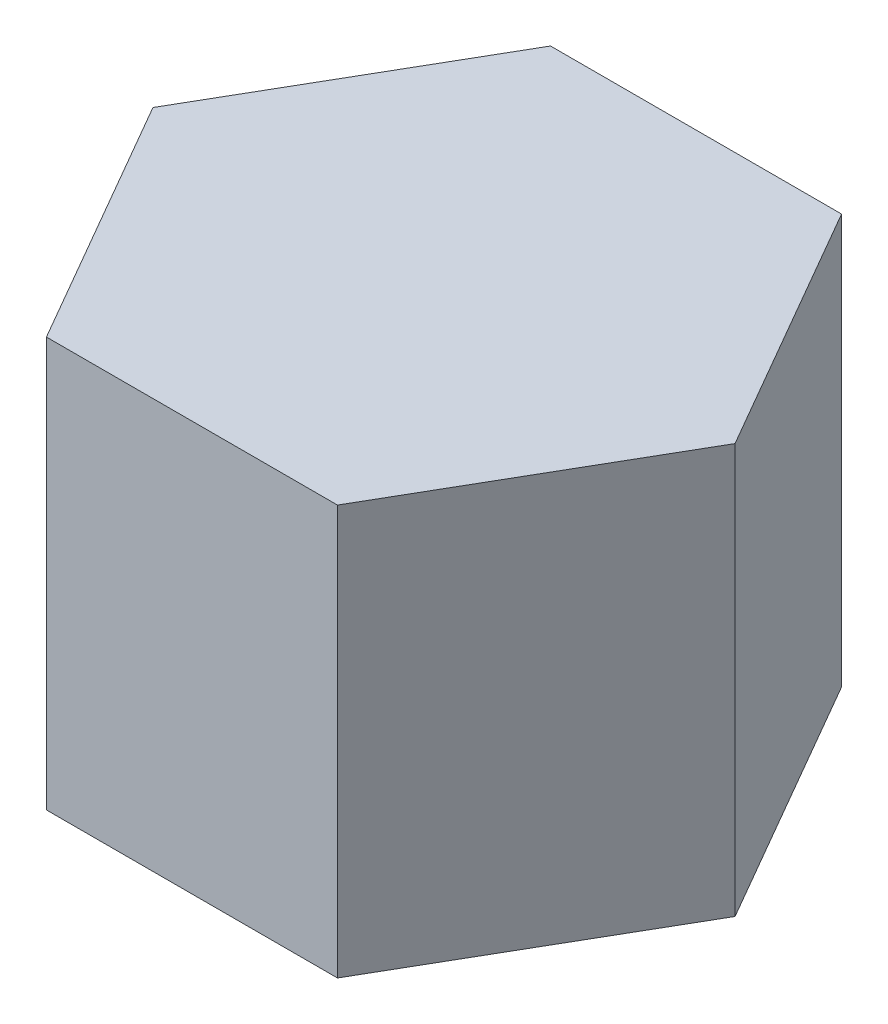
ISO-10303-21;
HEADER;
FILE_DESCRIPTION(('STEP AP214'),'2;1');
FILE_NAME('part.step','',(''),(''),'','','');
FILE_SCHEMA(('AUTOMOTIVE_DESIGN { 1 0 10303 214 1 1 1 1 }'));
ENDSEC;
DATA;
#1=APPLICATION_CONTEXT('core data for automotive mechanical design processes');
#2=APPLICATION_PROTOCOL_DEFINITION('international standard','automotive_design',2000,#1);
#3=PRODUCT_CONTEXT('',#1,'mechanical');
#4=PRODUCT('Part','Part','',(#3));
#5=PRODUCT_RELATED_PRODUCT_CATEGORY('part','',(#4));
#6=PRODUCT_DEFINITION_FORMATION('','',#4);
#7=PRODUCT_DEFINITION_CONTEXT('part definition',#1,'design');
#8=PRODUCT_DEFINITION('design','',#6,#7);
#9=PRODUCT_DEFINITION_SHAPE('','',#8);
#10=(LENGTH_UNIT() NAMED_UNIT(*) SI_UNIT(.MILLI.,.METRE.));
#11=(NAMED_UNIT(*) PLANE_ANGLE_UNIT() SI_UNIT($,.RADIAN.));
#12=(NAMED_UNIT(*) SI_UNIT($,.STERADIAN.) SOLID_ANGLE_UNIT());
#13=UNCERTAINTY_MEASURE_WITH_UNIT(LENGTH_MEASURE(1.E-05),#10,'distance_accuracy_value','');
#14=(GEOMETRIC_REPRESENTATION_CONTEXT(3) GLOBAL_UNCERTAINTY_ASSIGNED_CONTEXT((#13)) GLOBAL_UNIT_ASSIGNED_CONTEXT((#10,
#11,#12)) REPRESENTATION_CONTEXT('',''));
#15=CARTESIAN_POINT('',(0.,0.,0.));
#16=DIRECTION('',(0.,0.,1.));
#17=DIRECTION('',(1.,0.,0.));
#18=AXIS2_PLACEMENT_3D('',#15,#16,#17);
#19=CARTESIAN_POINT('',(46.1880215351701,-30.,80.));
#20=DIRECTION('',(0.866025403784439,0.,0.5));
#21=DIRECTION('',(0.5,0.,-0.866025403784439));
#22=AXIS2_PLACEMENT_3D('',#19,#20,#21);
#23=PLANE('',#22);
#24=DIRECTION('',(0.,1.,0.));
#25=VECTOR('',#24,1.);
#26=CARTESIAN_POINT('',(92.3760430703401,-30.,0.));
#27=LINE('',#26,#25);
#28=CARTESIAN_POINT('',(92.3760430703401,-30.,0.));
#29=VERTEX_POINT('',#28);
#30=CARTESIAN_POINT('',(92.3760430703401,100.,0.));
#31=VERTEX_POINT('',#30);
#32=EDGE_CURVE('E38',#29,#31,#27,.T.);
#33=ORIENTED_EDGE('',*,*,#32,.T.);
#34=DIRECTION('',(0.5,0.,-0.866025403784439));
#35=VECTOR('',#34,1.);
#36=CARTESIAN_POINT('',(46.1880215351701,100.,80.));
#37=LINE('',#36,#35);
#38=CARTESIAN_POINT('',(46.1880215351701,100.,80.));
#39=VERTEX_POINT('',#38);
#40=EDGE_CURVE('E87',#39,#31,#37,.T.);
#41=ORIENTED_EDGE('',*,*,#40,.F.);
#42=DIRECTION('',(0.,1.,0.));
#43=VECTOR('',#42,1.);
#44=CARTESIAN_POINT('',(46.1880215351701,-30.,80.));
#45=LINE('',#44,#43);
#46=CARTESIAN_POINT('',(46.1880215351701,-30.,80.));
#47=VERTEX_POINT('',#46);
#48=EDGE_CURVE('E11',#47,#39,#45,.T.);
#49=ORIENTED_EDGE('',*,*,#48,.F.);
#50=DIRECTION('',(0.5,0.,-0.866025403784439));
#51=VECTOR('',#50,1.);
#52=CARTESIAN_POINT('',(46.1880215351701,-30.,80.));
#53=LINE('',#52,#51);
#54=EDGE_CURVE('E88',#47,#29,#53,.T.);
#55=ORIENTED_EDGE('',*,*,#54,.T.);
#56=EDGE_LOOP('',(#33,#41,#49,#55));
#57=FACE_BOUND('',#56,.T.);
#58=ADVANCED_FACE('F35',(#57),#23,.T.);
#59=CARTESIAN_POINT('',(-46.1880215351701,-30.,80.));
#60=DIRECTION('',(0.,0.,1.));
#61=DIRECTION('',(1.,0.,0.));
#62=AXIS2_PLACEMENT_3D('',#59,#60,#61);
#63=PLANE('',#62);
#64=ORIENTED_EDGE('',*,*,#48,.T.);
#65=DIRECTION('',(1.,0.,0.));
#66=VECTOR('',#65,1.);
#67=CARTESIAN_POINT('',(-46.1880215351701,100.,80.));
#68=LINE('',#67,#66);
#69=CARTESIAN_POINT('',(-46.1880215351701,100.,80.));
#70=VERTEX_POINT('',#69);
#71=EDGE_CURVE('E105',#70,#39,#68,.T.);
#72=ORIENTED_EDGE('',*,*,#71,.F.);
#73=DIRECTION('',(0.,1.,0.));
#74=VECTOR('',#73,1.);
#75=CARTESIAN_POINT('',(-46.1880215351701,-30.,80.));
#76=LINE('',#75,#74);
#77=CARTESIAN_POINT('',(-46.1880215351701,-30.,80.));
#78=VERTEX_POINT('',#77);
#79=EDGE_CURVE('E43',#78,#70,#76,.T.);
#80=ORIENTED_EDGE('',*,*,#79,.F.);
#81=DIRECTION('',(1.,0.,0.));
#82=VECTOR('',#81,1.);
#83=CARTESIAN_POINT('',(-46.1880215351701,-30.,80.));
#84=LINE('',#83,#82);
#85=EDGE_CURVE('E93',#78,#47,#84,.T.);
#86=ORIENTED_EDGE('',*,*,#85,.T.);
#87=EDGE_LOOP('',(#64,#72,#80,#86));
#88=FACE_BOUND('',#87,.T.);
#89=ADVANCED_FACE('F145',(#88),#63,.T.);
#90=CARTESIAN_POINT('',(-92.3760430703402,-30.,0.));
#91=DIRECTION('',(-0.866025403784439,0.,0.5));
#92=DIRECTION('',(0.5,0.,0.866025403784439));
#93=AXIS2_PLACEMENT_3D('',#90,#91,#92);
#94=PLANE('',#93);
#95=ORIENTED_EDGE('',*,*,#79,.T.);
#96=DIRECTION('',(0.5,0.,0.866025403784439));
#97=VECTOR('',#96,1.);
#98=CARTESIAN_POINT('',(-92.3760430703402,100.,0.));
#99=LINE('',#98,#97);
#100=CARTESIAN_POINT('',(-92.3760430703402,100.,0.));
#101=VERTEX_POINT('',#100);
#102=EDGE_CURVE('E112',#101,#70,#99,.T.);
#103=ORIENTED_EDGE('',*,*,#102,.F.);
#104=DIRECTION('',(0.,1.,0.));
#105=VECTOR('',#104,1.);
#106=CARTESIAN_POINT('',(-92.3760430703402,-30.,0.));
#107=LINE('',#106,#105);
#108=CARTESIAN_POINT('',(-92.3760430703402,-30.,0.));
#109=VERTEX_POINT('',#108);
#110=EDGE_CURVE('E128',#109,#101,#107,.T.);
#111=ORIENTED_EDGE('',*,*,#110,.F.);
#112=DIRECTION('',(0.5,0.,0.866025403784439));
#113=VECTOR('',#112,1.);
#114=CARTESIAN_POINT('',(-92.3760430703402,-30.,0.));
#115=LINE('',#114,#113);
#116=EDGE_CURVE('E124',#109,#78,#115,.T.);
#117=ORIENTED_EDGE('',*,*,#116,.T.);
#118=EDGE_LOOP('',(#95,#103,#111,#117));
#119=FACE_BOUND('',#118,.T.);
#120=ADVANCED_FACE('F141',(#119),#94,.T.);
#121=CARTESIAN_POINT('',(-46.1880215351701,-30.,-80.));
#122=DIRECTION('',(-0.866025403784439,0.,-0.5));
#123=DIRECTION('',(-0.5,0.,0.866025403784439));
#124=AXIS2_PLACEMENT_3D('',#121,#122,#123);
#125=PLANE('',#124);
#126=ORIENTED_EDGE('',*,*,#110,.T.);
#127=DIRECTION('',(-0.5,0.,0.866025403784439));
#128=VECTOR('',#127,1.);
#129=CARTESIAN_POINT('',(-46.1880215351701,100.,-80.));
#130=LINE('',#129,#128);
#131=CARTESIAN_POINT('',(-46.1880215351701,100.,-80.));
#132=VERTEX_POINT('',#131);
#133=EDGE_CURVE('E109',#132,#101,#130,.T.);
#134=ORIENTED_EDGE('',*,*,#133,.F.);
#135=DIRECTION('',(0.,1.,0.));
#136=VECTOR('',#135,1.);
#137=CARTESIAN_POINT('',(-46.1880215351701,-30.,-80.));
#138=LINE('',#137,#136);
#139=CARTESIAN_POINT('',(-46.1880215351701,-30.,-80.));
#140=VERTEX_POINT('',#139);
#141=EDGE_CURVE('E130',#140,#132,#138,.T.);
#142=ORIENTED_EDGE('',*,*,#141,.F.);
#143=DIRECTION('',(-0.5,0.,0.866025403784439));
#144=VECTOR('',#143,1.);
#145=CARTESIAN_POINT('',(-46.1880215351701,-30.,-80.));
#146=LINE('',#145,#144);
#147=EDGE_CURVE('E121',#140,#109,#146,.T.);
#148=ORIENTED_EDGE('',*,*,#147,.T.);
#149=EDGE_LOOP('',(#126,#134,#142,#148));
#150=FACE_BOUND('',#149,.T.);
#151=ADVANCED_FACE('F138',(#150),#125,.T.);
#152=CARTESIAN_POINT('',(46.18802153517,-30.,-80.));
#153=DIRECTION('',(0.,0.,-1.));
#154=DIRECTION('',(-1.,0.,0.));
#155=AXIS2_PLACEMENT_3D('',#152,#153,#154);
#156=PLANE('',#155);
#157=ORIENTED_EDGE('',*,*,#141,.T.);
#158=DIRECTION('',(-1.,0.,0.));
#159=VECTOR('',#158,1.);
#160=CARTESIAN_POINT('',(46.18802153517,100.,-80.));
#161=LINE('',#160,#159);
#162=CARTESIAN_POINT('',(46.18802153517,100.,-80.));
#163=VERTEX_POINT('',#162);
#164=EDGE_CURVE('E100',#163,#132,#161,.T.);
#165=ORIENTED_EDGE('',*,*,#164,.F.);
#166=DIRECTION('',(0.,1.,0.));
#167=VECTOR('',#166,1.);
#168=CARTESIAN_POINT('',(46.18802153517,-30.,-80.));
#169=LINE('',#168,#167);
#170=CARTESIAN_POINT('',(46.18802153517,-30.,-80.));
#171=VERTEX_POINT('',#170);
#172=EDGE_CURVE('E92',#171,#163,#169,.T.);
#173=ORIENTED_EDGE('',*,*,#172,.F.);
#174=DIRECTION('',(-1.,0.,0.));
#175=VECTOR('',#174,1.);
#176=CARTESIAN_POINT('',(46.18802153517,-30.,-80.));
#177=LINE('',#176,#175);
#178=EDGE_CURVE('E118',#171,#140,#177,.T.);
#179=ORIENTED_EDGE('',*,*,#178,.T.);
#180=EDGE_LOOP('',(#157,#165,#173,#179));
#181=FACE_BOUND('',#180,.T.);
#182=ADVANCED_FACE('F132',(#181),#156,.T.);
#183=CARTESIAN_POINT('',(92.3760430703401,-30.,0.));
#184=DIRECTION('',(0.866025403784438,0.,-0.5));
#185=DIRECTION('',(-0.5,0.,-0.866025403784439));
#186=AXIS2_PLACEMENT_3D('',#183,#184,#185);
#187=PLANE('',#186);
#188=ORIENTED_EDGE('',*,*,#172,.T.);
#189=DIRECTION('',(-0.5,0.,-0.866025403784438));
#190=VECTOR('',#189,1.);
#191=CARTESIAN_POINT('',(92.3760430703401,100.,0.));
#192=LINE('',#191,#190);
#193=EDGE_CURVE('E95',#31,#163,#192,.T.);
#194=ORIENTED_EDGE('',*,*,#193,.F.);
#195=ORIENTED_EDGE('',*,*,#32,.F.);
#196=DIRECTION('',(-0.5,0.,-0.866025403784438));
#197=VECTOR('',#196,1.);
#198=CARTESIAN_POINT('',(92.3760430703401,-30.,0.));
#199=LINE('',#198,#197);
#200=EDGE_CURVE('E116',#29,#171,#199,.T.);
#201=ORIENTED_EDGE('',*,*,#200,.T.);
#202=EDGE_LOOP('',(#188,#194,#195,#201));
#203=FACE_BOUND('',#202,.T.);
#204=ADVANCED_FACE('F96',(#203),#187,.T.);
#205=CARTESIAN_POINT('',(0.,-30.,0.));
#206=DIRECTION('',(0.,1.,0.));
#207=DIRECTION('',(0.,0.,1.));
#208=AXIS2_PLACEMENT_3D('',#205,#206,#207);
#209=PLANE('',#208);
#210=ORIENTED_EDGE('',*,*,#54,.F.);
#211=ORIENTED_EDGE('',*,*,#85,.F.);
#212=ORIENTED_EDGE('',*,*,#116,.F.);
#213=ORIENTED_EDGE('',*,*,#147,.F.);
#214=ORIENTED_EDGE('',*,*,#178,.F.);
#215=ORIENTED_EDGE('',*,*,#200,.F.);
#216=EDGE_LOOP('',(#210,#211,#212,#213,#214,#215));
#217=FACE_BOUND('',#216,.T.);
#218=ADVANCED_FACE('F144',(#217),#209,.F.);
#219=CARTESIAN_POINT('',(0.,100.,0.));
#220=DIRECTION('',(0.,1.,0.));
#221=DIRECTION('',(0.,0.,1.));
#222=AXIS2_PLACEMENT_3D('',#219,#220,#221);
#223=PLANE('',#222);
#224=ORIENTED_EDGE('',*,*,#40,.T.);
#225=ORIENTED_EDGE('',*,*,#193,.T.);
#226=ORIENTED_EDGE('',*,*,#164,.T.);
#227=ORIENTED_EDGE('',*,*,#133,.T.);
#228=ORIENTED_EDGE('',*,*,#102,.T.);
#229=ORIENTED_EDGE('',*,*,#71,.T.);
#230=EDGE_LOOP('',(#224,#225,#226,#227,#228,#229));
#231=FACE_BOUND('',#230,.T.);
#232=ADVANCED_FACE('F103',(#231),#223,.T.);
#233=CLOSED_SHELL('',(#58,#89,#120,#151,#182,#204,#218,#232));
#234=MANIFOLD_SOLID_BREP('B2',#233);
#235=ADVANCED_BREP_SHAPE_REPRESENTATION('',(#18,#234),#14);
#236=SHAPE_DEFINITION_REPRESENTATION(#9,#235);
ENDSEC;
END-ISO-10303-21;
